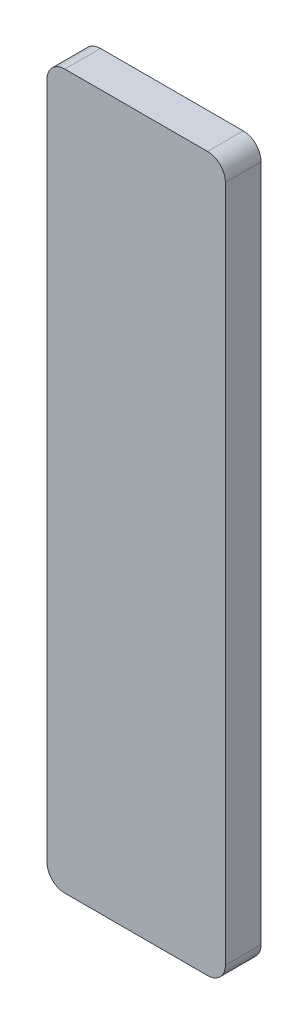
ISO-10303-21;
HEADER;
FILE_DESCRIPTION(('STEP AP214'),'2;1');
FILE_NAME('part.step','',(''),(''),'','','');
FILE_SCHEMA(('AUTOMOTIVE_DESIGN { 1 0 10303 214 1 1 1 1 }'));
ENDSEC;
DATA;
#1=APPLICATION_CONTEXT('core data for automotive mechanical design processes');
#2=APPLICATION_PROTOCOL_DEFINITION('international standard','automotive_design',2000,#1);
#3=PRODUCT_CONTEXT('',#1,'mechanical');
#4=PRODUCT('Part','Part','',(#3));
#5=PRODUCT_RELATED_PRODUCT_CATEGORY('part','',(#4));
#6=PRODUCT_DEFINITION_FORMATION('','',#4);
#7=PRODUCT_DEFINITION_CONTEXT('part definition',#1,'design');
#8=PRODUCT_DEFINITION('design','',#6,#7);
#9=PRODUCT_DEFINITION_SHAPE('','',#8);
#10=(LENGTH_UNIT() NAMED_UNIT(*) SI_UNIT(.MILLI.,.METRE.));
#11=(NAMED_UNIT(*) PLANE_ANGLE_UNIT() SI_UNIT($,.RADIAN.));
#12=(NAMED_UNIT(*) SI_UNIT($,.STERADIAN.) SOLID_ANGLE_UNIT());
#13=UNCERTAINTY_MEASURE_WITH_UNIT(LENGTH_MEASURE(1.E-05),#10,'distance_accuracy_value','');
#14=(GEOMETRIC_REPRESENTATION_CONTEXT(3) GLOBAL_UNCERTAINTY_ASSIGNED_CONTEXT((#13)) GLOBAL_UNIT_ASSIGNED_CONTEXT((#10,
#11,#12)) REPRESENTATION_CONTEXT('',''));
#15=CARTESIAN_POINT('',(0.,0.,0.));
#16=DIRECTION('',(0.,0.,1.));
#17=DIRECTION('',(1.,0.,0.));
#18=AXIS2_PLACEMENT_3D('',#15,#16,#17);
#19=CARTESIAN_POINT('',(40.,-190.,20.));
#20=DIRECTION('',(0.,0.,-1.));
#21=DIRECTION('',(-1.,0.,0.));
#22=AXIS2_PLACEMENT_3D('',#19,#20,#21);
#23=CYLINDRICAL_SURFACE('',#22,10.);
#24=CARTESIAN_POINT('',(40.,-190.,0.));
#25=DIRECTION('',(0.,0.,1.));
#26=DIRECTION('',(1.,0.,0.));
#27=AXIS2_PLACEMENT_3D('',#24,#25,#26);
#28=CIRCLE('',#27,10.);
#29=CARTESIAN_POINT('',(39.9999999999999,-200.,0.));
#30=VERTEX_POINT('',#29);
#31=CARTESIAN_POINT('',(50.,-190.,0.));
#32=VERTEX_POINT('',#31);
#33=EDGE_CURVE('E129',#30,#32,#28,.T.);
#34=ORIENTED_EDGE('',*,*,#33,.T.);
#35=DIRECTION('',(0.,0.,-1.));
#36=VECTOR('',#35,1.);
#37=CARTESIAN_POINT('',(50.,-190.,20.));
#38=LINE('',#37,#36);
#39=CARTESIAN_POINT('',(50.,-190.,20.));
#40=VERTEX_POINT('',#39);
#41=EDGE_CURVE('E11',#40,#32,#38,.T.);
#42=ORIENTED_EDGE('',*,*,#41,.F.);
#43=CARTESIAN_POINT('',(40.,-190.,20.));
#44=DIRECTION('',(0.,0.,1.));
#45=DIRECTION('',(1.,0.,0.));
#46=AXIS2_PLACEMENT_3D('',#43,#44,#45);
#47=CIRCLE('',#46,10.);
#48=CARTESIAN_POINT('',(39.9999999999999,-200.,20.));
#49=VERTEX_POINT('',#48);
#50=EDGE_CURVE('E143',#49,#40,#47,.T.);
#51=ORIENTED_EDGE('',*,*,#50,.F.);
#52=DIRECTION('',(0.,0.,-1.));
#53=VECTOR('',#52,1.);
#54=CARTESIAN_POINT('',(39.9999999999999,-200.,20.));
#55=LINE('',#54,#53);
#56=EDGE_CURVE('E125',#49,#30,#55,.T.);
#57=ORIENTED_EDGE('',*,*,#56,.T.);
#58=EDGE_LOOP('',(#34,#42,#51,#57));
#59=FACE_BOUND('',#58,.T.);
#60=ADVANCED_FACE('F33',(#59),#23,.T.);
#61=CARTESIAN_POINT('',(50.,-190.,20.));
#62=DIRECTION('',(-1.,0.,0.));
#63=DIRECTION('',(0.,0.,1.));
#64=AXIS2_PLACEMENT_3D('',#61,#62,#63);
#65=PLANE('',#64);
#66=DIRECTION('',(0.,1.,0.));
#67=VECTOR('',#66,1.);
#68=CARTESIAN_POINT('',(50.,-190.,0.));
#69=LINE('',#68,#67);
#70=CARTESIAN_POINT('',(50.,190.,0.));
#71=VERTEX_POINT('',#70);
#72=EDGE_CURVE('E132',#32,#71,#69,.T.);
#73=ORIENTED_EDGE('',*,*,#72,.T.);
#74=DIRECTION('',(0.,0.,-1.));
#75=VECTOR('',#74,1.);
#76=CARTESIAN_POINT('',(50.,190.,20.));
#77=LINE('',#76,#75);
#78=CARTESIAN_POINT('',(50.,190.,20.));
#79=VERTEX_POINT('',#78);
#80=EDGE_CURVE('E41',#79,#71,#77,.T.);
#81=ORIENTED_EDGE('',*,*,#80,.F.);
#82=DIRECTION('',(0.,1.,0.));
#83=VECTOR('',#82,1.);
#84=CARTESIAN_POINT('',(50.,-190.,20.));
#85=LINE('',#84,#83);
#86=EDGE_CURVE('E92',#40,#79,#85,.T.);
#87=ORIENTED_EDGE('',*,*,#86,.F.);
#88=ORIENTED_EDGE('',*,*,#41,.T.);
#89=EDGE_LOOP('',(#73,#81,#87,#88));
#90=FACE_BOUND('',#89,.T.);
#91=ADVANCED_FACE('F178',(#90),#65,.F.);
#92=CARTESIAN_POINT('',(40.,190.,20.));
#93=DIRECTION('',(0.,0.,-1.));
#94=DIRECTION('',(-1.,0.,0.));
#95=AXIS2_PLACEMENT_3D('',#92,#93,#94);
#96=CYLINDRICAL_SURFACE('',#95,10.);
#97=CARTESIAN_POINT('',(40.,190.,0.));
#98=DIRECTION('',(0.,0.,1.));
#99=DIRECTION('',(-1.,0.,0.));
#100=AXIS2_PLACEMENT_3D('',#97,#98,#99);
#101=CIRCLE('',#100,10.);
#102=CARTESIAN_POINT('',(39.9999999999999,200.,0.));
#103=VERTEX_POINT('',#102);
#104=EDGE_CURVE('E134',#71,#103,#101,.T.);
#105=ORIENTED_EDGE('',*,*,#104,.T.);
#106=DIRECTION('',(0.,0.,-1.));
#107=VECTOR('',#106,1.);
#108=CARTESIAN_POINT('',(39.9999999999999,200.,20.));
#109=LINE('',#108,#107);
#110=CARTESIAN_POINT('',(39.9999999999999,200.,20.));
#111=VERTEX_POINT('',#110);
#112=EDGE_CURVE('E150',#111,#103,#109,.T.);
#113=ORIENTED_EDGE('',*,*,#112,.F.);
#114=CARTESIAN_POINT('',(40.,190.,20.));
#115=DIRECTION('',(0.,0.,1.));
#116=DIRECTION('',(-1.,0.,0.));
#117=AXIS2_PLACEMENT_3D('',#114,#115,#116);
#118=CIRCLE('',#117,10.);
#119=EDGE_CURVE('E158',#79,#111,#118,.T.);
#120=ORIENTED_EDGE('',*,*,#119,.F.);
#121=ORIENTED_EDGE('',*,*,#80,.T.);
#122=EDGE_LOOP('',(#105,#113,#120,#121));
#123=FACE_BOUND('',#122,.T.);
#124=ADVANCED_FACE('F156',(#123),#96,.T.);
#125=CARTESIAN_POINT('',(-39.9999999999999,200.,20.));
#126=DIRECTION('',(0.,-1.,0.));
#127=DIRECTION('',(0.,0.,-1.));
#128=AXIS2_PLACEMENT_3D('',#125,#126,#127);
#129=PLANE('',#128);
#130=DIRECTION('',(-1.,0.,0.));
#131=VECTOR('',#130,1.);
#132=CARTESIAN_POINT('',(-39.9999999999999,200.,0.));
#133=LINE('',#132,#131);
#134=CARTESIAN_POINT('',(-39.9999999999999,200.,0.));
#135=VERTEX_POINT('',#134);
#136=EDGE_CURVE('E136',#103,#135,#133,.T.);
#137=ORIENTED_EDGE('',*,*,#136,.T.);
#138=DIRECTION('',(0.,0.,-1.));
#139=VECTOR('',#138,1.);
#140=CARTESIAN_POINT('',(-39.9999999999999,200.,20.));
#141=LINE('',#140,#139);
#142=CARTESIAN_POINT('',(-39.9999999999999,200.,20.));
#143=VERTEX_POINT('',#142);
#144=EDGE_CURVE('E147',#143,#135,#141,.T.);
#145=ORIENTED_EDGE('',*,*,#144,.F.);
#146=DIRECTION('',(-1.,0.,0.));
#147=VECTOR('',#146,1.);
#148=CARTESIAN_POINT('',(-39.9999999999999,200.,20.));
#149=LINE('',#148,#147);
#150=EDGE_CURVE('E170',#111,#143,#149,.T.);
#151=ORIENTED_EDGE('',*,*,#150,.F.);
#152=ORIENTED_EDGE('',*,*,#112,.T.);
#153=EDGE_LOOP('',(#137,#145,#151,#152));
#154=FACE_BOUND('',#153,.T.);
#155=ADVANCED_FACE('F166',(#154),#129,.F.);
#156=CARTESIAN_POINT('',(-40.,190.,20.));
#157=DIRECTION('',(0.,0.,-1.));
#158=DIRECTION('',(-1.,0.,0.));
#159=AXIS2_PLACEMENT_3D('',#156,#157,#158);
#160=CYLINDRICAL_SURFACE('',#159,10.);
#161=CARTESIAN_POINT('',(-40.,190.,0.));
#162=DIRECTION('',(0.,0.,1.));
#163=DIRECTION('',(-1.,0.,0.));
#164=AXIS2_PLACEMENT_3D('',#161,#162,#163);
#165=CIRCLE('',#164,10.);
#166=CARTESIAN_POINT('',(-50.,190.,0.));
#167=VERTEX_POINT('',#166);
#168=EDGE_CURVE('E138',#135,#167,#165,.T.);
#169=ORIENTED_EDGE('',*,*,#168,.T.);
#170=DIRECTION('',(0.,0.,-1.));
#171=VECTOR('',#170,1.);
#172=CARTESIAN_POINT('',(-50.,190.,20.));
#173=LINE('',#172,#171);
#174=CARTESIAN_POINT('',(-50.,190.,20.));
#175=VERTEX_POINT('',#174);
#176=EDGE_CURVE('E120',#175,#167,#173,.T.);
#177=ORIENTED_EDGE('',*,*,#176,.F.);
#178=CARTESIAN_POINT('',(-40.,190.,20.));
#179=DIRECTION('',(0.,0.,1.));
#180=DIRECTION('',(-1.,0.,0.));
#181=AXIS2_PLACEMENT_3D('',#178,#179,#180);
#182=CIRCLE('',#181,10.);
#183=EDGE_CURVE('E111',#143,#175,#182,.T.);
#184=ORIENTED_EDGE('',*,*,#183,.F.);
#185=ORIENTED_EDGE('',*,*,#144,.T.);
#186=EDGE_LOOP('',(#169,#177,#184,#185));
#187=FACE_BOUND('',#186,.T.);
#188=ADVANCED_FACE('F169',(#187),#160,.T.);
#189=CARTESIAN_POINT('',(-50.,-190.,20.));
#190=DIRECTION('',(1.,0.,0.));
#191=DIRECTION('',(0.,0.,-1.));
#192=AXIS2_PLACEMENT_3D('',#189,#190,#191);
#193=PLANE('',#192);
#194=DIRECTION('',(0.,-1.,0.));
#195=VECTOR('',#194,1.);
#196=CARTESIAN_POINT('',(-50.,-190.,0.));
#197=LINE('',#196,#195);
#198=CARTESIAN_POINT('',(-50.,-190.,0.));
#199=VERTEX_POINT('',#198);
#200=EDGE_CURVE('E119',#167,#199,#197,.T.);
#201=ORIENTED_EDGE('',*,*,#200,.T.);
#202=DIRECTION('',(0.,0.,-1.));
#203=VECTOR('',#202,1.);
#204=CARTESIAN_POINT('',(-50.,-190.,20.));
#205=LINE('',#204,#203);
#206=CARTESIAN_POINT('',(-50.,-190.,20.));
#207=VERTEX_POINT('',#206);
#208=EDGE_CURVE('E116',#207,#199,#205,.T.);
#209=ORIENTED_EDGE('',*,*,#208,.F.);
#210=DIRECTION('',(0.,-1.,0.));
#211=VECTOR('',#210,1.);
#212=CARTESIAN_POINT('',(-50.,-190.,20.));
#213=LINE('',#212,#211);
#214=EDGE_CURVE('E105',#175,#207,#213,.T.);
#215=ORIENTED_EDGE('',*,*,#214,.F.);
#216=ORIENTED_EDGE('',*,*,#176,.T.);
#217=EDGE_LOOP('',(#201,#209,#215,#216));
#218=FACE_BOUND('',#217,.T.);
#219=ADVANCED_FACE('F117',(#218),#193,.F.);
#220=CARTESIAN_POINT('',(-40.,-190.,20.));
#221=DIRECTION('',(0.,0.,-1.));
#222=DIRECTION('',(-1.,0.,0.));
#223=AXIS2_PLACEMENT_3D('',#220,#221,#222);
#224=CYLINDRICAL_SURFACE('',#223,10.);
#225=CARTESIAN_POINT('',(-40.,-190.,0.));
#226=DIRECTION('',(0.,0.,1.));
#227=DIRECTION('',(-1.,0.,0.));
#228=AXIS2_PLACEMENT_3D('',#225,#226,#227);
#229=CIRCLE('',#228,10.);
#230=CARTESIAN_POINT('',(-39.9999999999999,-200.,0.));
#231=VERTEX_POINT('',#230);
#232=EDGE_CURVE('E78',#199,#231,#229,.T.);
#233=ORIENTED_EDGE('',*,*,#232,.T.);
#234=DIRECTION('',(0.,0.,-1.));
#235=VECTOR('',#234,1.);
#236=CARTESIAN_POINT('',(-39.9999999999999,-200.,20.));
#237=LINE('',#236,#235);
#238=CARTESIAN_POINT('',(-39.9999999999999,-200.,20.));
#239=VERTEX_POINT('',#238);
#240=EDGE_CURVE('E121',#239,#231,#237,.T.);
#241=ORIENTED_EDGE('',*,*,#240,.F.);
#242=CARTESIAN_POINT('',(-40.,-190.,20.));
#243=DIRECTION('',(0.,0.,1.));
#244=DIRECTION('',(-1.,0.,0.));
#245=AXIS2_PLACEMENT_3D('',#242,#243,#244);
#246=CIRCLE('',#245,10.);
#247=EDGE_CURVE('E109',#207,#239,#246,.T.);
#248=ORIENTED_EDGE('',*,*,#247,.F.);
#249=ORIENTED_EDGE('',*,*,#208,.T.);
#250=EDGE_LOOP('',(#233,#241,#248,#249));
#251=FACE_BOUND('',#250,.T.);
#252=ADVANCED_FACE('F123',(#251),#224,.T.);
#253=CARTESIAN_POINT('',(-39.9999999999999,-200.,20.));
#254=DIRECTION('',(0.,1.,0.));
#255=DIRECTION('',(0.,0.,1.));
#256=AXIS2_PLACEMENT_3D('',#253,#254,#255);
#257=PLANE('',#256);
#258=DIRECTION('',(1.,0.,0.));
#259=VECTOR('',#258,1.);
#260=CARTESIAN_POINT('',(-39.9999999999999,-200.,0.));
#261=LINE('',#260,#259);
#262=EDGE_CURVE('E84',#231,#30,#261,.T.);
#263=ORIENTED_EDGE('',*,*,#262,.T.);
#264=ORIENTED_EDGE('',*,*,#56,.F.);
#265=DIRECTION('',(1.,0.,0.));
#266=VECTOR('',#265,1.);
#267=CARTESIAN_POINT('',(-39.9999999999999,-200.,20.));
#268=LINE('',#267,#266);
#269=EDGE_CURVE('E49',#239,#49,#268,.T.);
#270=ORIENTED_EDGE('',*,*,#269,.F.);
#271=ORIENTED_EDGE('',*,*,#240,.T.);
#272=EDGE_LOOP('',(#263,#264,#270,#271));
#273=FACE_BOUND('',#272,.T.);
#274=ADVANCED_FACE('F194',(#273),#257,.F.);
#275=CARTESIAN_POINT('',(40.,-190.,20.));
#276=DIRECTION('',(0.,0.,1.));
#277=DIRECTION('',(1.,0.,0.));
#278=AXIS2_PLACEMENT_3D('',#275,#276,#277);
#279=PLANE('',#278);
#280=ORIENTED_EDGE('',*,*,#50,.T.);
#281=ORIENTED_EDGE('',*,*,#86,.T.);
#282=ORIENTED_EDGE('',*,*,#119,.T.);
#283=ORIENTED_EDGE('',*,*,#150,.T.);
#284=ORIENTED_EDGE('',*,*,#183,.T.);
#285=ORIENTED_EDGE('',*,*,#214,.T.);
#286=ORIENTED_EDGE('',*,*,#247,.T.);
#287=ORIENTED_EDGE('',*,*,#269,.T.);
#288=EDGE_LOOP('',(#280,#281,#282,#283,#284,#285,#286,#287));
#289=FACE_BOUND('',#288,.T.);
#290=ADVANCED_FACE('F107',(#289),#279,.T.);
#291=CARTESIAN_POINT('',(40.,-190.,0.));
#292=DIRECTION('',(0.,0.,1.));
#293=DIRECTION('',(1.,0.,0.));
#294=AXIS2_PLACEMENT_3D('',#291,#292,#293);
#295=PLANE('',#294);
#296=ORIENTED_EDGE('',*,*,#33,.F.);
#297=ORIENTED_EDGE('',*,*,#262,.F.);
#298=ORIENTED_EDGE('',*,*,#232,.F.);
#299=ORIENTED_EDGE('',*,*,#200,.F.);
#300=ORIENTED_EDGE('',*,*,#168,.F.);
#301=ORIENTED_EDGE('',*,*,#136,.F.);
#302=ORIENTED_EDGE('',*,*,#104,.F.);
#303=ORIENTED_EDGE('',*,*,#72,.F.);
#304=EDGE_LOOP('',(#296,#297,#298,#299,#300,#301,#302,#303));
#305=FACE_BOUND('',#304,.T.);
#306=ADVANCED_FACE('F162',(#305),#295,.F.);
#307=CLOSED_SHELL('',(#60,#91,#124,#155,#188,#219,#252,#274,#290,#306));
#308=MANIFOLD_SOLID_BREP('B2',#307);
#309=ADVANCED_BREP_SHAPE_REPRESENTATION('',(#18,#308),#14);
#310=SHAPE_DEFINITION_REPRESENTATION(#9,#309);
ENDSEC;
END-ISO-10303-21;
